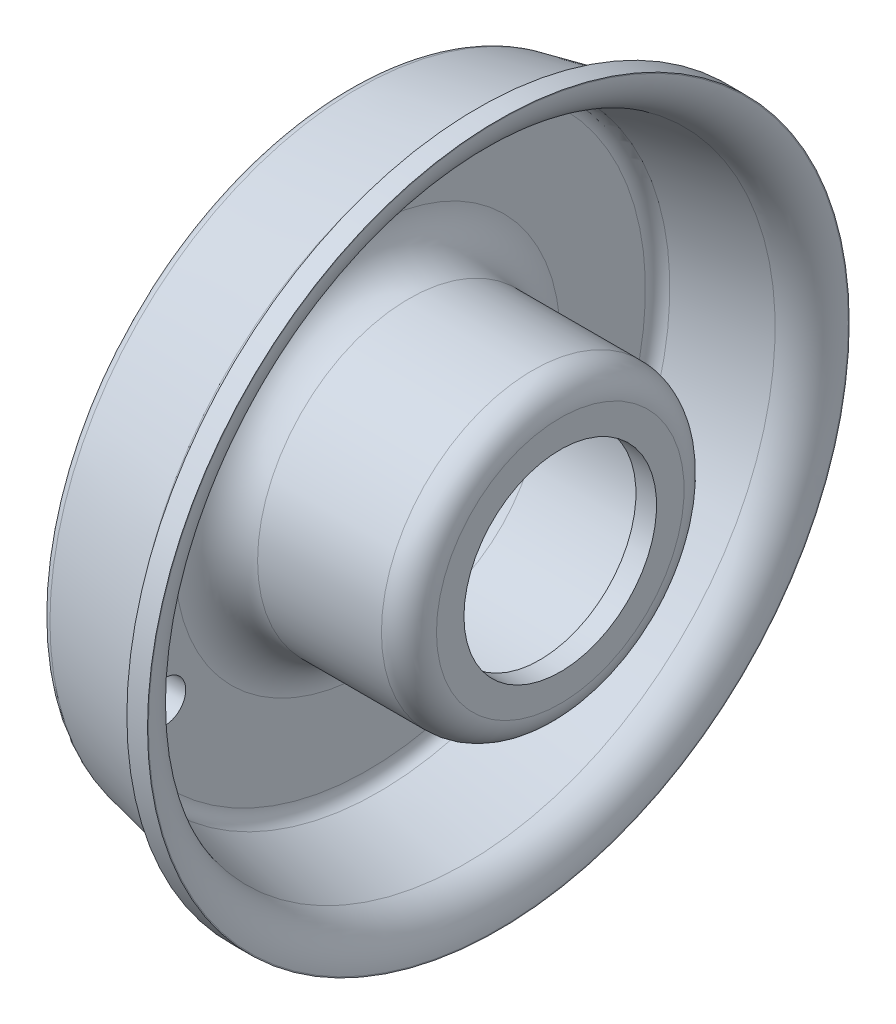
ISO-10303-21;
HEADER;
FILE_DESCRIPTION(('STEP AP214'),'2;1');
FILE_NAME('part.step','',(''),(''),'','','');
FILE_SCHEMA(('AUTOMOTIVE_DESIGN { 1 0 10303 214 1 1 1 1 }'));
ENDSEC;
DATA;
#1=APPLICATION_CONTEXT('core data for automotive mechanical design processes');
#2=APPLICATION_PROTOCOL_DEFINITION('international standard','automotive_design',2000,#1);
#3=PRODUCT_CONTEXT('',#1,'mechanical');
#4=PRODUCT('Part','Part','',(#3));
#5=PRODUCT_RELATED_PRODUCT_CATEGORY('part','',(#4));
#6=PRODUCT_DEFINITION_FORMATION('','',#4);
#7=PRODUCT_DEFINITION_CONTEXT('part definition',#1,'design');
#8=PRODUCT_DEFINITION('design','',#6,#7);
#9=PRODUCT_DEFINITION_SHAPE('','',#8);
#10=(LENGTH_UNIT() NAMED_UNIT(*) SI_UNIT(.MILLI.,.METRE.));
#11=(NAMED_UNIT(*) PLANE_ANGLE_UNIT() SI_UNIT($,.RADIAN.));
#12=(NAMED_UNIT(*) SI_UNIT($,.STERADIAN.) SOLID_ANGLE_UNIT());
#13=UNCERTAINTY_MEASURE_WITH_UNIT(LENGTH_MEASURE(1.E-05),#10,'distance_accuracy_value','');
#14=(GEOMETRIC_REPRESENTATION_CONTEXT(3) GLOBAL_UNCERTAINTY_ASSIGNED_CONTEXT((#13)) GLOBAL_UNIT_ASSIGNED_CONTEXT((#10,
#11,#12)) REPRESENTATION_CONTEXT('',''));
#15=CARTESIAN_POINT('',(0.,0.,0.));
#16=DIRECTION('',(0.,0.,1.));
#17=DIRECTION('',(1.,0.,0.));
#18=AXIS2_PLACEMENT_3D('',#15,#16,#17);
#19=CARTESIAN_POINT('',(20.,0.,0.));
#20=DIRECTION('',(-1.,0.,0.));
#21=DIRECTION('',(0.,0.,1.));
#22=AXIS2_PLACEMENT_3D('',#19,#20,#21);
#23=TOROIDAL_SURFACE('',#22,14.,4.5);
#24=CARTESIAN_POINT('',(15.5,0.,0.));
#25=DIRECTION('',(-1.,0.,0.));
#26=DIRECTION('',(0.,0.,1.));
#27=AXIS2_PLACEMENT_3D('',#24,#25,#26);
#28=CIRCLE('',#27,14.);
#29=CARTESIAN_POINT('',(15.5,0.,14.));
#30=VERTEX_POINT('',#29);
#31=EDGE_CURVE('E64',#30,#30,#28,.T.);
#32=ORIENTED_EDGE('',*,*,#31,.T.);
#33=EDGE_LOOP('',(#32));
#34=FACE_BOUND('',#33,.T.);
#35=CARTESIAN_POINT('',(20.,0.,0.));
#36=DIRECTION('',(-1.,0.,0.));
#37=DIRECTION('',(0.,0.,1.));
#38=AXIS2_PLACEMENT_3D('',#35,#36,#37);
#39=CIRCLE('',#38,9.5);
#40=CARTESIAN_POINT('',(20.,0.,9.5));
#41=VERTEX_POINT('',#40);
#42=EDGE_CURVE('E10',#41,#41,#39,.T.);
#43=ORIENTED_EDGE('',*,*,#42,.F.);
#44=EDGE_LOOP('',(#43));
#45=FACE_BOUND('',#44,.T.);
#46=ADVANCED_FACE('F30',(#34,#45),#23,.T.);
#47=CARTESIAN_POINT('',(15.5,0.,0.));
#48=DIRECTION('',(-1.,0.,0.));
#49=DIRECTION('',(0.,0.,1.));
#50=AXIS2_PLACEMENT_3D('',#47,#48,#49);
#51=CYLINDRICAL_SURFACE('',#50,9.5);
#52=ORIENTED_EDGE('',*,*,#42,.T.);
#53=EDGE_LOOP('',(#52));
#54=FACE_BOUND('',#53,.T.);
#55=CARTESIAN_POINT('',(29.,0.,0.));
#56=DIRECTION('',(-1.,0.,0.));
#57=DIRECTION('',(0.,0.,1.));
#58=AXIS2_PLACEMENT_3D('',#55,#56,#57);
#59=CIRCLE('',#58,9.5);
#60=CARTESIAN_POINT('',(29.,0.,9.5));
#61=VERTEX_POINT('',#60);
#62=EDGE_CURVE('E37',#61,#61,#59,.T.);
#63=ORIENTED_EDGE('',*,*,#62,.F.);
#64=EDGE_LOOP('',(#63));
#65=FACE_BOUND('',#64,.T.);
#66=ADVANCED_FACE('F122',(#54,#65),#51,.F.);
#67=CARTESIAN_POINT('',(29.,0.,0.));
#68=DIRECTION('',(-1.,0.,0.));
#69=DIRECTION('',(0.,0.,1.));
#70=AXIS2_PLACEMENT_3D('',#67,#68,#69);
#71=TOROIDAL_SURFACE('',#70,9.,0.5);
#72=ORIENTED_EDGE('',*,*,#62,.T.);
#73=EDGE_LOOP('',(#72));
#74=FACE_BOUND('',#73,.T.);
#75=CARTESIAN_POINT('',(29.5,0.,0.));
#76=DIRECTION('',(-1.,0.,0.));
#77=DIRECTION('',(0.,0.,1.));
#78=AXIS2_PLACEMENT_3D('',#75,#76,#77);
#79=CIRCLE('',#78,9.);
#80=CARTESIAN_POINT('',(29.5,0.,9.));
#81=VERTEX_POINT('',#80);
#82=EDGE_CURVE('E42',#81,#81,#79,.T.);
#83=ORIENTED_EDGE('',*,*,#82,.F.);
#84=EDGE_LOOP('',(#83));
#85=FACE_BOUND('',#84,.T.);
#86=ADVANCED_FACE('F120',(#74,#85),#71,.F.);
#87=CARTESIAN_POINT('',(29.5,0.,7.));
#88=DIRECTION('',(-1.,0.,0.));
#89=DIRECTION('',(0.,0.,1.));
#90=AXIS2_PLACEMENT_3D('',#87,#88,#89);
#91=PLANE('',#90);
#92=ORIENTED_EDGE('',*,*,#82,.T.);
#93=EDGE_LOOP('',(#92));
#94=FACE_BOUND('',#93,.T.);
#95=CARTESIAN_POINT('',(29.5,0.,0.));
#96=DIRECTION('',(-1.,0.,0.));
#97=DIRECTION('',(0.,0.,1.));
#98=AXIS2_PLACEMENT_3D('',#95,#96,#97);
#99=CIRCLE('',#98,7.);
#100=CARTESIAN_POINT('',(29.5,0.,7.));
#101=VERTEX_POINT('',#100);
#102=EDGE_CURVE('E112',#101,#101,#99,.T.);
#103=ORIENTED_EDGE('',*,*,#102,.F.);
#104=EDGE_LOOP('',(#103));
#105=FACE_BOUND('',#104,.T.);
#106=ADVANCED_FACE('F117',(#94,#105),#91,.T.);
#107=CARTESIAN_POINT('',(15.5,0.,0.));
#108=DIRECTION('',(-1.,0.,0.));
#109=DIRECTION('',(0.,0.,1.));
#110=AXIS2_PLACEMENT_3D('',#107,#108,#109);
#111=CYLINDRICAL_SURFACE('',#110,7.);
#112=ORIENTED_EDGE('',*,*,#102,.T.);
#113=EDGE_LOOP('',(#112));
#114=FACE_BOUND('',#113,.T.);
#115=CARTESIAN_POINT('',(31.,0.,0.));
#116=DIRECTION('',(-1.,0.,0.));
#117=DIRECTION('',(0.,0.,1.));
#118=AXIS2_PLACEMENT_3D('',#115,#116,#117);
#119=CIRCLE('',#118,7.);
#120=CARTESIAN_POINT('',(31.,0.,7.));
#121=VERTEX_POINT('',#120);
#122=EDGE_CURVE('E109',#121,#121,#119,.T.);
#123=ORIENTED_EDGE('',*,*,#122,.F.);
#124=EDGE_LOOP('',(#123));
#125=FACE_BOUND('',#124,.T.);
#126=ADVANCED_FACE('F129',(#114,#125),#111,.F.);
#127=CARTESIAN_POINT('',(31.,0.,7.));
#128=DIRECTION('',(1.,0.,0.));
#129=DIRECTION('',(0.,0.,-1.));
#130=AXIS2_PLACEMENT_3D('',#127,#128,#129);
#131=PLANE('',#130);
#132=ORIENTED_EDGE('',*,*,#122,.T.);
#133=EDGE_LOOP('',(#132));
#134=FACE_BOUND('',#133,.T.);
#135=CARTESIAN_POINT('',(31.,0.,0.));
#136=DIRECTION('',(-1.,0.,0.));
#137=DIRECTION('',(0.,0.,1.));
#138=AXIS2_PLACEMENT_3D('',#135,#136,#137);
#139=CIRCLE('',#138,8.99999999999999);
#140=CARTESIAN_POINT('',(31.,0.,8.99999999999999));
#141=VERTEX_POINT('',#140);
#142=EDGE_CURVE('E106',#141,#141,#139,.T.);
#143=ORIENTED_EDGE('',*,*,#142,.F.);
#144=EDGE_LOOP('',(#143));
#145=FACE_BOUND('',#144,.T.);
#146=ADVANCED_FACE('F203',(#134,#145),#131,.T.);
#147=CARTESIAN_POINT('',(29.,0.,0.));
#148=DIRECTION('',(-1.,0.,0.));
#149=DIRECTION('',(0.,0.,1.));
#150=AXIS2_PLACEMENT_3D('',#147,#148,#149);
#151=TOROIDAL_SURFACE('',#150,9.,2.);
#152=ORIENTED_EDGE('',*,*,#142,.T.);
#153=EDGE_LOOP('',(#152));
#154=FACE_BOUND('',#153,.T.);
#155=CARTESIAN_POINT('',(29.,0.,0.));
#156=DIRECTION('',(-1.,0.,0.));
#157=DIRECTION('',(0.,0.,1.));
#158=AXIS2_PLACEMENT_3D('',#155,#156,#157);
#159=CIRCLE('',#158,11.);
#160=CARTESIAN_POINT('',(29.,0.,11.));
#161=VERTEX_POINT('',#160);
#162=EDGE_CURVE('E103',#161,#161,#159,.T.);
#163=ORIENTED_EDGE('',*,*,#162,.F.);
#164=EDGE_LOOP('',(#163));
#165=FACE_BOUND('',#164,.T.);
#166=ADVANCED_FACE('F199',(#154,#165),#151,.T.);
#167=CARTESIAN_POINT('',(15.5,0.,0.));
#168=DIRECTION('',(-1.,0.,0.));
#169=DIRECTION('',(0.,0.,1.));
#170=AXIS2_PLACEMENT_3D('',#167,#168,#169);
#171=CYLINDRICAL_SURFACE('',#170,11.);
#172=ORIENTED_EDGE('',*,*,#162,.T.);
#173=EDGE_LOOP('',(#172));
#174=FACE_BOUND('',#173,.T.);
#175=CARTESIAN_POINT('',(20.,0.,0.));
#176=DIRECTION('',(-1.,0.,0.));
#177=DIRECTION('',(0.,0.,1.));
#178=AXIS2_PLACEMENT_3D('',#175,#176,#177);
#179=CIRCLE('',#178,11.);
#180=CARTESIAN_POINT('',(20.,0.,11.));
#181=VERTEX_POINT('',#180);
#182=EDGE_CURVE('E100',#181,#181,#179,.T.);
#183=ORIENTED_EDGE('',*,*,#182,.F.);
#184=EDGE_LOOP('',(#183));
#185=FACE_BOUND('',#184,.T.);
#186=ADVANCED_FACE('F195',(#174,#185),#171,.T.);
#187=CARTESIAN_POINT('',(20.,0.,0.));
#188=DIRECTION('',(-1.,0.,0.));
#189=DIRECTION('',(0.,0.,1.));
#190=AXIS2_PLACEMENT_3D('',#187,#188,#189);
#191=TOROIDAL_SURFACE('',#190,14.,3.);
#192=ORIENTED_EDGE('',*,*,#182,.T.);
#193=EDGE_LOOP('',(#192));
#194=FACE_BOUND('',#193,.T.);
#195=CARTESIAN_POINT('',(17.,0.,0.));
#196=DIRECTION('',(-1.,0.,0.));
#197=DIRECTION('',(0.,0.,1.));
#198=AXIS2_PLACEMENT_3D('',#195,#196,#197);
#199=CIRCLE('',#198,14.);
#200=CARTESIAN_POINT('',(17.,0.,14.));
#201=VERTEX_POINT('',#200);
#202=EDGE_CURVE('E97',#201,#201,#199,.T.);
#203=ORIENTED_EDGE('',*,*,#202,.F.);
#204=EDGE_LOOP('',(#203));
#205=FACE_BOUND('',#204,.T.);
#206=ADVANCED_FACE('F191',(#194,#205),#191,.F.);
#207=CARTESIAN_POINT('',(17.,0.,14.));
#208=DIRECTION('',(1.,0.,0.));
#209=DIRECTION('',(0.,0.,-1.));
#210=AXIS2_PLACEMENT_3D('',#207,#208,#209);
#211=PLANE('',#210);
#212=CARTESIAN_POINT('',(17.,17.,0.));
#213=DIRECTION('',(1.,0.,0.));
#214=DIRECTION('',(0.,0.,-1.));
#215=AXIS2_PLACEMENT_3D('',#212,#213,#214);
#216=CIRCLE('',#215,1.5);
#217=CARTESIAN_POINT('',(17.,17.,-1.5));
#218=VERTEX_POINT('',#217);
#219=EDGE_CURVE('E61',#218,#218,#216,.F.);
#220=ORIENTED_EDGE('',*,*,#219,.T.);
#221=EDGE_LOOP('',(#220));
#222=FACE_BOUND('',#221,.T.);
#223=CARTESIAN_POINT('',(17.,-8.49999999999937,-14.7224318643365));
#224=DIRECTION('',(1.,0.,0.));
#225=DIRECTION('',(0.,0.,-1.));
#226=AXIS2_PLACEMENT_3D('',#223,#224,#225);
#227=CIRCLE('',#226,1.5);
#228=CARTESIAN_POINT('',(17.,-8.49999999999937,-16.2224318643365));
#229=VERTEX_POINT('',#228);
#230=EDGE_CURVE('E51',#229,#229,#227,.F.);
#231=ORIENTED_EDGE('',*,*,#230,.T.);
#232=EDGE_LOOP('',(#231));
#233=FACE_BOUND('',#232,.T.);
#234=CARTESIAN_POINT('',(17.,-8.50000000000063,14.7224318643344));
#235=DIRECTION('',(1.,0.,0.));
#236=DIRECTION('',(0.,0.,-1.));
#237=AXIS2_PLACEMENT_3D('',#234,#235,#236);
#238=CIRCLE('',#237,1.5);
#239=CARTESIAN_POINT('',(17.,-8.50000000000063,13.2224318643344));
#240=VERTEX_POINT('',#239);
#241=EDGE_CURVE('E48',#240,#240,#238,.F.);
#242=ORIENTED_EDGE('',*,*,#241,.T.);
#243=EDGE_LOOP('',(#242));
#244=FACE_BOUND('',#243,.T.);
#245=ORIENTED_EDGE('',*,*,#202,.T.);
#246=EDGE_LOOP('',(#245));
#247=FACE_BOUND('',#246,.T.);
#248=CARTESIAN_POINT('',(17.,0.,0.));
#249=DIRECTION('',(-1.,0.,0.));
#250=DIRECTION('',(0.,0.,1.));
#251=AXIS2_PLACEMENT_3D('',#248,#249,#250);
#252=CIRCLE('',#251,20.1886059032133);
#253=CARTESIAN_POINT('',(17.,0.,20.1886059032133));
#254=VERTEX_POINT('',#253);
#255=EDGE_CURVE('E94',#254,#254,#252,.T.);
#256=ORIENTED_EDGE('',*,*,#255,.F.);
#257=EDGE_LOOP('',(#256));
#258=FACE_BOUND('',#257,.T.);
#259=ADVANCED_FACE('F187',(#222,#233,#244,#247,#258),#211,.T.);
#260=CARTESIAN_POINT('',(18.,0.,0.));
#261=DIRECTION('',(-1.,0.,0.));
#262=DIRECTION('',(0.,0.,1.));
#263=AXIS2_PLACEMENT_3D('',#260,#261,#262);
#264=TOROIDAL_SURFACE('',#263,20.1886059032133,1.);
#265=ORIENTED_EDGE('',*,*,#255,.T.);
#266=EDGE_LOOP('',(#265));
#267=FACE_BOUND('',#266,.T.);
#268=CARTESIAN_POINT('',(17.7939895189502,0.,0.));
#269=DIRECTION('',(-1.,0.,0.));
#270=DIRECTION('',(0.,0.,1.));
#271=AXIS2_PLACEMENT_3D('',#268,#269,#270);
#272=CIRCLE('',#271,21.1671556882);
#273=CARTESIAN_POINT('',(17.7939895189502,0.,21.1671556882));
#274=VERTEX_POINT('',#273);
#275=EDGE_CURVE('E91',#274,#274,#272,.T.);
#276=ORIENTED_EDGE('',*,*,#275,.F.);
#277=EDGE_LOOP('',(#276));
#278=FACE_BOUND('',#277,.T.);
#279=ADVANCED_FACE('F183',(#267,#278),#264,.F.);
#280=CARTESIAN_POINT('',(24.1180314431495,0.,0.));
#281=DIRECTION('',(1.,0.,0.));
#282=DIRECTION('',(0.,0.,-1.));
#283=AXIS2_PLACEMENT_3D('',#280,#281,#282);
#284=CONICAL_SURFACE('',#283,22.4985329353999,0.207496226435203);
#285=ORIENTED_EDGE('',*,*,#275,.T.);
#286=EDGE_LOOP('',(#285));
#287=FACE_BOUND('',#286,.T.);
#288=CARTESIAN_POINT('',(24.1180314431495,0.,0.));
#289=DIRECTION('',(-1.,0.,0.));
#290=DIRECTION('',(0.,0.,1.));
#291=AXIS2_PLACEMENT_3D('',#288,#289,#290);
#292=CIRCLE('',#291,22.4985329353999);
#293=CARTESIAN_POINT('',(24.1180314431495,0.,22.4985329353999));
#294=VERTEX_POINT('',#293);
#295=EDGE_CURVE('E88',#294,#294,#292,.T.);
#296=ORIENTED_EDGE('',*,*,#295,.F.);
#297=EDGE_LOOP('',(#296));
#298=FACE_BOUND('',#297,.T.);
#299=ADVANCED_FACE('F179',(#287,#298),#284,.F.);
#300=CARTESIAN_POINT('',(23.5,0.,0.));
#301=DIRECTION('',(-1.,0.,0.));
#302=DIRECTION('',(0.,0.,1.));
#303=AXIS2_PLACEMENT_3D('',#300,#301,#302);
#304=TOROIDAL_SURFACE('',#303,25.4341822903601,3.);
#305=ORIENTED_EDGE('',*,*,#295,.T.);
#306=EDGE_LOOP('',(#305));
#307=FACE_BOUND('',#306,.T.);
#308=CARTESIAN_POINT('',(26.5,0.,0.));
#309=DIRECTION('',(-1.,0.,0.));
#310=DIRECTION('',(0.,0.,1.));
#311=AXIS2_PLACEMENT_3D('',#308,#309,#310);
#312=CIRCLE('',#311,25.4341822903602);
#313=CARTESIAN_POINT('',(26.5,0.,25.4341822903602));
#314=VERTEX_POINT('',#313);
#315=EDGE_CURVE('E85',#314,#314,#312,.T.);
#316=ORIENTED_EDGE('',*,*,#315,.F.);
#317=EDGE_LOOP('',(#316));
#318=FACE_BOUND('',#317,.T.);
#319=ADVANCED_FACE('F175',(#307,#318),#304,.T.);
#320=CARTESIAN_POINT('',(26.5,0.,25.4341822903602));
#321=DIRECTION('',(1.,0.,0.));
#322=DIRECTION('',(0.,0.,-1.));
#323=AXIS2_PLACEMENT_3D('',#320,#321,#322);
#324=PLANE('',#323);
#325=ORIENTED_EDGE('',*,*,#315,.T.);
#326=EDGE_LOOP('',(#325));
#327=FACE_BOUND('',#326,.T.);
#328=CARTESIAN_POINT('',(26.5,0.,0.));
#329=DIRECTION('',(-1.,0.,0.));
#330=DIRECTION('',(0.,0.,1.));
#331=AXIS2_PLACEMENT_3D('',#328,#329,#330);
#332=CIRCLE('',#331,25.5);
#333=CARTESIAN_POINT('',(26.5,0.,25.5));
#334=VERTEX_POINT('',#333);
#335=EDGE_CURVE('E82',#334,#334,#332,.T.);
#336=ORIENTED_EDGE('',*,*,#335,.F.);
#337=EDGE_LOOP('',(#336));
#338=FACE_BOUND('',#337,.T.);
#339=ADVANCED_FACE('F171',(#327,#338),#324,.T.);
#340=CARTESIAN_POINT('',(15.5,0.,0.));
#341=DIRECTION('',(-1.,0.,0.));
#342=DIRECTION('',(0.,0.,1.));
#343=AXIS2_PLACEMENT_3D('',#340,#341,#342);
#344=CYLINDRICAL_SURFACE('',#343,25.5);
#345=ORIENTED_EDGE('',*,*,#335,.T.);
#346=EDGE_LOOP('',(#345));
#347=FACE_BOUND('',#346,.T.);
#348=CARTESIAN_POINT('',(25.,0.,0.));
#349=DIRECTION('',(-1.,0.,0.));
#350=DIRECTION('',(0.,0.,1.));
#351=AXIS2_PLACEMENT_3D('',#348,#349,#350);
#352=CIRCLE('',#351,25.5);
#353=CARTESIAN_POINT('',(25.,0.,25.5));
#354=VERTEX_POINT('',#353);
#355=EDGE_CURVE('E79',#354,#354,#352,.T.);
#356=ORIENTED_EDGE('',*,*,#355,.F.);
#357=EDGE_LOOP('',(#356));
#358=FACE_BOUND('',#357,.T.);
#359=ADVANCED_FACE('F167',(#347,#358),#344,.T.);
#360=CARTESIAN_POINT('',(25.,0.,25.4341822903602));
#361=DIRECTION('',(-1.,0.,0.));
#362=DIRECTION('',(0.,0.,1.));
#363=AXIS2_PLACEMENT_3D('',#360,#361,#362);
#364=PLANE('',#363);
#365=ORIENTED_EDGE('',*,*,#355,.T.);
#366=EDGE_LOOP('',(#365));
#367=FACE_BOUND('',#366,.T.);
#368=CARTESIAN_POINT('',(25.,0.,0.));
#369=DIRECTION('',(-1.,0.,0.));
#370=DIRECTION('',(0.,0.,1.));
#371=AXIS2_PLACEMENT_3D('',#368,#369,#370);
#372=CIRCLE('',#371,25.4341822903602);
#373=CARTESIAN_POINT('',(25.,0.,25.4341822903602));
#374=VERTEX_POINT('',#373);
#375=EDGE_CURVE('E76',#374,#374,#372,.T.);
#376=ORIENTED_EDGE('',*,*,#375,.F.);
#377=EDGE_LOOP('',(#376));
#378=FACE_BOUND('',#377,.T.);
#379=ADVANCED_FACE('F163',(#367,#378),#364,.T.);
#380=CARTESIAN_POINT('',(23.5,0.,0.));
#381=DIRECTION('',(-1.,0.,0.));
#382=DIRECTION('',(0.,0.,1.));
#383=AXIS2_PLACEMENT_3D('',#380,#381,#382);
#384=TOROIDAL_SURFACE('',#383,25.4341822903601,1.5);
#385=ORIENTED_EDGE('',*,*,#375,.T.);
#386=EDGE_LOOP('',(#385));
#387=FACE_BOUND('',#386,.T.);
#388=CARTESIAN_POINT('',(23.8090157215747,0.,0.));
#389=DIRECTION('',(-1.,0.,0.));
#390=DIRECTION('',(0.,0.,1.));
#391=AXIS2_PLACEMENT_3D('',#388,#389,#390);
#392=CIRCLE('',#391,23.96635761288);
#393=CARTESIAN_POINT('',(23.8090157215747,0.,23.96635761288));
#394=VERTEX_POINT('',#393);
#395=EDGE_CURVE('E73',#394,#394,#392,.T.);
#396=ORIENTED_EDGE('',*,*,#395,.F.);
#397=EDGE_LOOP('',(#396));
#398=FACE_BOUND('',#397,.T.);
#399=ADVANCED_FACE('F159',(#387,#398),#384,.F.);
#400=CARTESIAN_POINT('',(16.2939895189502,0.,0.));
#401=DIRECTION('',(1.,0.,0.));
#402=DIRECTION('',(0.,0.,-1.));
#403=AXIS2_PLACEMENT_3D('',#400,#401,#402);
#404=CONICAL_SURFACE('',#403,22.3842468333801,0.207496226435202);
#405=ORIENTED_EDGE('',*,*,#395,.T.);
#406=EDGE_LOOP('',(#405));
#407=FACE_BOUND('',#406,.T.);
#408=CARTESIAN_POINT('',(16.2939895189502,0.,0.));
#409=DIRECTION('',(-1.,0.,0.));
#410=DIRECTION('',(0.,0.,1.));
#411=AXIS2_PLACEMENT_3D('',#408,#409,#410);
#412=CIRCLE('',#411,22.3842468333801);
#413=CARTESIAN_POINT('',(16.2939895189502,0.,22.3842468333801));
#414=VERTEX_POINT('',#413);
#415=EDGE_CURVE('E70',#414,#414,#412,.T.);
#416=ORIENTED_EDGE('',*,*,#415,.F.);
#417=EDGE_LOOP('',(#416));
#418=FACE_BOUND('',#417,.T.);
#419=ADVANCED_FACE('F151',(#407,#418),#404,.T.);
#420=CARTESIAN_POINT('',(16.5,0.,0.));
#421=DIRECTION('',(-1.,0.,0.));
#422=DIRECTION('',(0.,0.,1.));
#423=AXIS2_PLACEMENT_3D('',#420,#421,#422);
#424=TOROIDAL_SURFACE('',#423,21.4056970483934,1.);
#425=ORIENTED_EDGE('',*,*,#415,.T.);
#426=EDGE_LOOP('',(#425));
#427=FACE_BOUND('',#426,.T.);
#428=CARTESIAN_POINT('',(15.5,0.,0.));
#429=DIRECTION('',(-1.,0.,0.));
#430=DIRECTION('',(0.,0.,1.));
#431=AXIS2_PLACEMENT_3D('',#428,#429,#430);
#432=CIRCLE('',#431,21.4056970483934);
#433=CARTESIAN_POINT('',(15.5,0.,21.4056970483934));
#434=VERTEX_POINT('',#433);
#435=EDGE_CURVE('E67',#434,#434,#432,.T.);
#436=ORIENTED_EDGE('',*,*,#435,.F.);
#437=EDGE_LOOP('',(#436));
#438=FACE_BOUND('',#437,.T.);
#439=ADVANCED_FACE('F141',(#427,#438),#424,.T.);
#440=CARTESIAN_POINT('',(15.5,0.,14.));
#441=DIRECTION('',(-1.,0.,0.));
#442=DIRECTION('',(0.,0.,1.));
#443=AXIS2_PLACEMENT_3D('',#440,#441,#442);
#444=PLANE('',#443);
#445=CARTESIAN_POINT('',(15.5,17.,0.));
#446=DIRECTION('',(-1.,0.,0.));
#447=DIRECTION('',(0.,0.,1.));
#448=AXIS2_PLACEMENT_3D('',#445,#446,#447);
#449=CIRCLE('',#448,1.5);
#450=CARTESIAN_POINT('',(15.5,17.,1.5));
#451=VERTEX_POINT('',#450);
#452=EDGE_CURVE('E33',#451,#451,#449,.F.);
#453=ORIENTED_EDGE('',*,*,#452,.T.);
#454=EDGE_LOOP('',(#453));
#455=FACE_BOUND('',#454,.T.);
#456=CARTESIAN_POINT('',(15.5,-8.49999999999937,-14.7224318643365));
#457=DIRECTION('',(-1.,0.,0.));
#458=DIRECTION('',(0.,0.,1.));
#459=AXIS2_PLACEMENT_3D('',#456,#457,#458);
#460=CIRCLE('',#459,1.5);
#461=CARTESIAN_POINT('',(15.5,-8.49999999999937,-13.2224318643365));
#462=VERTEX_POINT('',#461);
#463=EDGE_CURVE('E49',#462,#462,#460,.F.);
#464=ORIENTED_EDGE('',*,*,#463,.T.);
#465=EDGE_LOOP('',(#464));
#466=FACE_BOUND('',#465,.T.);
#467=CARTESIAN_POINT('',(15.5,-8.50000000000063,14.7224318643344));
#468=DIRECTION('',(-1.,0.,0.));
#469=DIRECTION('',(0.,0.,1.));
#470=AXIS2_PLACEMENT_3D('',#467,#468,#469);
#471=CIRCLE('',#470,1.5);
#472=CARTESIAN_POINT('',(15.5,-8.50000000000063,16.2224318643344));
#473=VERTEX_POINT('',#472);
#474=EDGE_CURVE('E46',#473,#473,#471,.F.);
#475=ORIENTED_EDGE('',*,*,#474,.T.);
#476=EDGE_LOOP('',(#475));
#477=FACE_BOUND('',#476,.T.);
#478=ORIENTED_EDGE('',*,*,#435,.T.);
#479=EDGE_LOOP('',(#478));
#480=FACE_BOUND('',#479,.T.);
#481=ORIENTED_EDGE('',*,*,#31,.F.);
#482=EDGE_LOOP('',(#481));
#483=FACE_BOUND('',#482,.T.);
#484=ADVANCED_FACE('F138',(#455,#466,#477,#480,#483),#444,.T.);
#485=CARTESIAN_POINT('',(25.,-8.50000000000063,14.7224318643344));
#486=DIRECTION('',(-1.,0.,0.));
#487=DIRECTION('',(0.,0.,1.));
#488=AXIS2_PLACEMENT_3D('',#485,#486,#487);
#489=CYLINDRICAL_SURFACE('',#488,1.5);
#490=ORIENTED_EDGE('',*,*,#241,.F.);
#491=EDGE_LOOP('',(#490));
#492=FACE_BOUND('',#491,.T.);
#493=ORIENTED_EDGE('',*,*,#474,.F.);
#494=EDGE_LOOP('',(#493));
#495=FACE_BOUND('',#494,.T.);
#496=ADVANCED_FACE('F140',(#492,#495),#489,.F.);
#497=CARTESIAN_POINT('',(25.,-8.49999999999937,-14.7224318643365));
#498=DIRECTION('',(-1.,0.,0.));
#499=DIRECTION('',(0.,0.,1.));
#500=AXIS2_PLACEMENT_3D('',#497,#498,#499);
#501=CYLINDRICAL_SURFACE('',#500,1.5);
#502=ORIENTED_EDGE('',*,*,#230,.F.);
#503=EDGE_LOOP('',(#502));
#504=FACE_BOUND('',#503,.T.);
#505=ORIENTED_EDGE('',*,*,#463,.F.);
#506=EDGE_LOOP('',(#505));
#507=FACE_BOUND('',#506,.T.);
#508=ADVANCED_FACE('F148',(#504,#507),#501,.F.);
#509=CARTESIAN_POINT('',(25.,17.,0.));
#510=DIRECTION('',(-1.,0.,0.));
#511=DIRECTION('',(0.,0.,1.));
#512=AXIS2_PLACEMENT_3D('',#509,#510,#511);
#513=CYLINDRICAL_SURFACE('',#512,1.5);
#514=ORIENTED_EDGE('',*,*,#219,.F.);
#515=EDGE_LOOP('',(#514));
#516=FACE_BOUND('',#515,.T.);
#517=ORIENTED_EDGE('',*,*,#452,.F.);
#518=EDGE_LOOP('',(#517));
#519=FACE_BOUND('',#518,.T.);
#520=ADVANCED_FACE('F324',(#516,#519),#513,.F.);
#521=CLOSED_SHELL('',(#46,#66,#86,#106,#126,#146,#166,#186,#206,#259,#279,#299,#319,#339,#359,
#379,#399,#419,#439,#484,#496,#508,#520));
#522=MANIFOLD_SOLID_BREP('B2',#521);
#523=ADVANCED_BREP_SHAPE_REPRESENTATION('',(#18,#522),#14);
#524=SHAPE_DEFINITION_REPRESENTATION(#9,#523);
ENDSEC;
END-ISO-10303-21;
